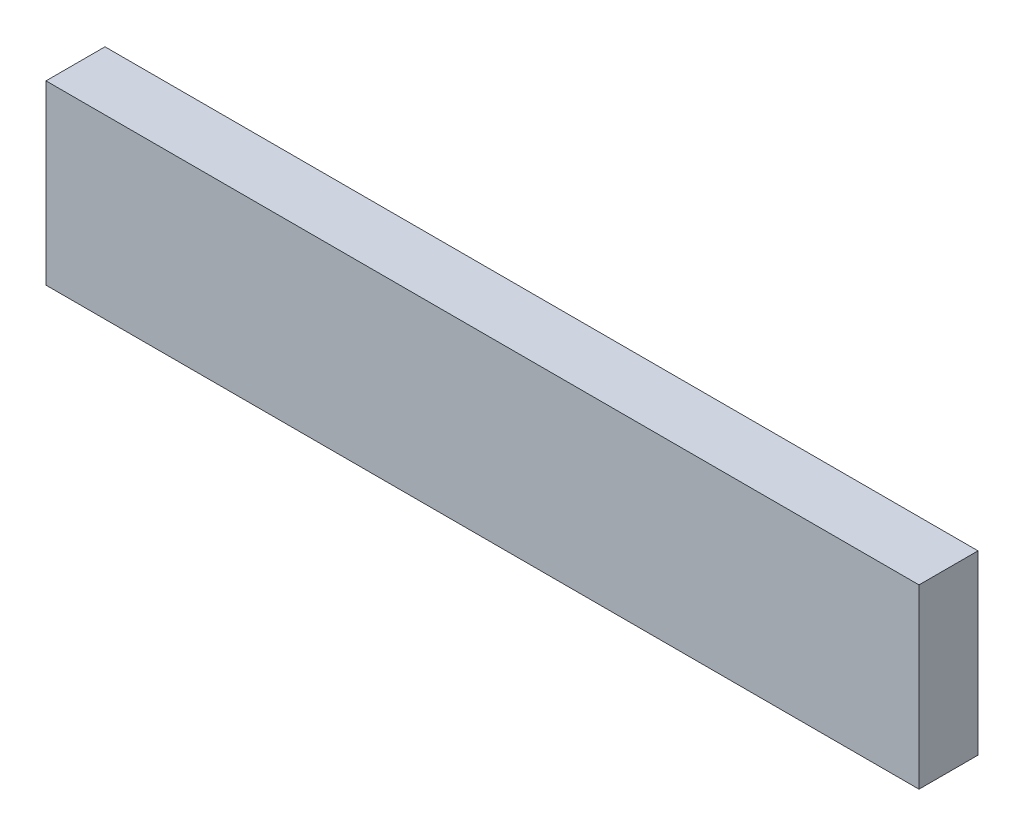
ISO-10303-21;
HEADER;
FILE_DESCRIPTION(('STEP AP214'),'2;1');
FILE_NAME('part.step','',(''),(''),'','','');
FILE_SCHEMA(('AUTOMOTIVE_DESIGN { 1 0 10303 214 1 1 1 1 }'));
ENDSEC;
DATA;
#1=APPLICATION_CONTEXT('core data for automotive mechanical design processes');
#2=APPLICATION_PROTOCOL_DEFINITION('international standard','automotive_design',2000,#1);
#3=PRODUCT_CONTEXT('',#1,'mechanical');
#4=PRODUCT('Part','Part','',(#3));
#5=PRODUCT_RELATED_PRODUCT_CATEGORY('part','',(#4));
#6=PRODUCT_DEFINITION_FORMATION('','',#4);
#7=PRODUCT_DEFINITION_CONTEXT('part definition',#1,'design');
#8=PRODUCT_DEFINITION('design','',#6,#7);
#9=PRODUCT_DEFINITION_SHAPE('','',#8);
#10=(LENGTH_UNIT() NAMED_UNIT(*) SI_UNIT(.MILLI.,.METRE.));
#11=(NAMED_UNIT(*) PLANE_ANGLE_UNIT() SI_UNIT($,.RADIAN.));
#12=(NAMED_UNIT(*) SI_UNIT($,.STERADIAN.) SOLID_ANGLE_UNIT());
#13=UNCERTAINTY_MEASURE_WITH_UNIT(LENGTH_MEASURE(1.E-05),#10,'distance_accuracy_value','');
#14=(GEOMETRIC_REPRESENTATION_CONTEXT(3) GLOBAL_UNCERTAINTY_ASSIGNED_CONTEXT((#13)) GLOBAL_UNIT_ASSIGNED_CONTEXT((#10,
#11,#12)) REPRESENTATION_CONTEXT('',''));
#15=CARTESIAN_POINT('',(0.,0.,0.));
#16=DIRECTION('',(0.,0.,1.));
#17=DIRECTION('',(1.,0.,0.));
#18=AXIS2_PLACEMENT_3D('',#15,#16,#17);
#19=CARTESIAN_POINT('',(37.,7.5,5.));
#20=DIRECTION('',(-1.,0.,0.));
#21=DIRECTION('',(0.,0.,1.));
#22=AXIS2_PLACEMENT_3D('',#19,#20,#21);
#23=PLANE('',#22);
#24=DIRECTION('',(0.,1.,0.));
#25=VECTOR('',#24,1.);
#26=CARTESIAN_POINT('',(37.,7.5,0.));
#27=LINE('',#26,#25);
#28=CARTESIAN_POINT('',(37.,-7.5,0.));
#29=VERTEX_POINT('',#28);
#30=CARTESIAN_POINT('',(37.,7.5,0.));
#31=VERTEX_POINT('',#30);
#32=EDGE_CURVE('E107',#29,#31,#27,.T.);
#33=ORIENTED_EDGE('',*,*,#32,.T.);
#34=DIRECTION('',(0.,0.,-1.));
#35=VECTOR('',#34,1.);
#36=CARTESIAN_POINT('',(37.,7.5,5.));
#37=LINE('',#36,#35);
#38=CARTESIAN_POINT('',(37.,7.5,5.));
#39=VERTEX_POINT('',#38);
#40=EDGE_CURVE('E11',#39,#31,#37,.T.);
#41=ORIENTED_EDGE('',*,*,#40,.F.);
#42=DIRECTION('',(0.,1.,0.));
#43=VECTOR('',#42,1.);
#44=CARTESIAN_POINT('',(37.,7.5,5.));
#45=LINE('',#44,#43);
#46=CARTESIAN_POINT('',(37.,-7.5,5.));
#47=VERTEX_POINT('',#46);
#48=EDGE_CURVE('E91',#47,#39,#45,.T.);
#49=ORIENTED_EDGE('',*,*,#48,.F.);
#50=DIRECTION('',(0.,0.,-1.));
#51=VECTOR('',#50,1.);
#52=CARTESIAN_POINT('',(37.,-7.5,5.));
#53=LINE('',#52,#51);
#54=EDGE_CURVE('E103',#47,#29,#53,.T.);
#55=ORIENTED_EDGE('',*,*,#54,.T.);
#56=EDGE_LOOP('',(#33,#41,#49,#55));
#57=FACE_BOUND('',#56,.T.);
#58=ADVANCED_FACE('F39',(#57),#23,.F.);
#59=CARTESIAN_POINT('',(-37.,7.5,5.));
#60=DIRECTION('',(0.,-1.,0.));
#61=DIRECTION('',(0.,0.,-1.));
#62=AXIS2_PLACEMENT_3D('',#59,#60,#61);
#63=PLANE('',#62);
#64=DIRECTION('',(-1.,0.,0.));
#65=VECTOR('',#64,1.);
#66=CARTESIAN_POINT('',(-37.,7.5,0.));
#67=LINE('',#66,#65);
#68=CARTESIAN_POINT('',(-37.,7.5,0.));
#69=VERTEX_POINT('',#68);
#70=EDGE_CURVE('E96',#31,#69,#67,.T.);
#71=ORIENTED_EDGE('',*,*,#70,.T.);
#72=DIRECTION('',(0.,0.,-1.));
#73=VECTOR('',#72,1.);
#74=CARTESIAN_POINT('',(-37.,7.5,5.));
#75=LINE('',#74,#73);
#76=CARTESIAN_POINT('',(-37.,7.5,5.));
#77=VERTEX_POINT('',#76);
#78=EDGE_CURVE('E48',#77,#69,#75,.T.);
#79=ORIENTED_EDGE('',*,*,#78,.F.);
#80=DIRECTION('',(-1.,0.,0.));
#81=VECTOR('',#80,1.);
#82=CARTESIAN_POINT('',(-37.,7.5,5.));
#83=LINE('',#82,#81);
#84=EDGE_CURVE('E86',#39,#77,#83,.T.);
#85=ORIENTED_EDGE('',*,*,#84,.F.);
#86=ORIENTED_EDGE('',*,*,#40,.T.);
#87=EDGE_LOOP('',(#71,#79,#85,#86));
#88=FACE_BOUND('',#87,.T.);
#89=ADVANCED_FACE('F95',(#88),#63,.F.);
#90=CARTESIAN_POINT('',(-37.,7.5,5.));
#91=DIRECTION('',(1.,0.,0.));
#92=DIRECTION('',(0.,0.,-1.));
#93=AXIS2_PLACEMENT_3D('',#90,#91,#92);
#94=PLANE('',#93);
#95=DIRECTION('',(0.,-1.,0.));
#96=VECTOR('',#95,1.);
#97=CARTESIAN_POINT('',(-37.,7.5,0.));
#98=LINE('',#97,#96);
#99=CARTESIAN_POINT('',(-37.,-7.5,0.));
#100=VERTEX_POINT('',#99);
#101=EDGE_CURVE('E73',#69,#100,#98,.T.);
#102=ORIENTED_EDGE('',*,*,#101,.T.);
#103=DIRECTION('',(0.,0.,-1.));
#104=VECTOR('',#103,1.);
#105=CARTESIAN_POINT('',(-37.,-7.5,5.));
#106=LINE('',#105,#104);
#107=CARTESIAN_POINT('',(-37.,-7.5,5.));
#108=VERTEX_POINT('',#107);
#109=EDGE_CURVE('E98',#108,#100,#106,.T.);
#110=ORIENTED_EDGE('',*,*,#109,.F.);
#111=DIRECTION('',(0.,-1.,0.));
#112=VECTOR('',#111,1.);
#113=CARTESIAN_POINT('',(-37.,7.5,5.));
#114=LINE('',#113,#112);
#115=EDGE_CURVE('E89',#77,#108,#114,.T.);
#116=ORIENTED_EDGE('',*,*,#115,.F.);
#117=ORIENTED_EDGE('',*,*,#78,.T.);
#118=EDGE_LOOP('',(#102,#110,#116,#117));
#119=FACE_BOUND('',#118,.T.);
#120=ADVANCED_FACE('F99',(#119),#94,.F.);
#121=CARTESIAN_POINT('',(-37.,-7.5,5.));
#122=DIRECTION('',(0.,1.,0.));
#123=DIRECTION('',(0.,0.,1.));
#124=AXIS2_PLACEMENT_3D('',#121,#122,#123);
#125=PLANE('',#124);
#126=DIRECTION('',(1.,0.,0.));
#127=VECTOR('',#126,1.);
#128=CARTESIAN_POINT('',(-37.,-7.5,0.));
#129=LINE('',#128,#127);
#130=EDGE_CURVE('E79',#100,#29,#129,.T.);
#131=ORIENTED_EDGE('',*,*,#130,.T.);
#132=ORIENTED_EDGE('',*,*,#54,.F.);
#133=DIRECTION('',(1.,0.,0.));
#134=VECTOR('',#133,1.);
#135=CARTESIAN_POINT('',(-37.,-7.5,5.));
#136=LINE('',#135,#134);
#137=EDGE_CURVE('E56',#108,#47,#136,.T.);
#138=ORIENTED_EDGE('',*,*,#137,.F.);
#139=ORIENTED_EDGE('',*,*,#109,.T.);
#140=EDGE_LOOP('',(#131,#132,#138,#139));
#141=FACE_BOUND('',#140,.T.);
#142=ADVANCED_FACE('F120',(#141),#125,.F.);
#143=CARTESIAN_POINT('',(0.,0.,5.));
#144=DIRECTION('',(0.,0.,1.));
#145=DIRECTION('',(1.,0.,0.));
#146=AXIS2_PLACEMENT_3D('',#143,#144,#145);
#147=PLANE('',#146);
#148=ORIENTED_EDGE('',*,*,#48,.T.);
#149=ORIENTED_EDGE('',*,*,#84,.T.);
#150=ORIENTED_EDGE('',*,*,#115,.T.);
#151=ORIENTED_EDGE('',*,*,#137,.T.);
#152=EDGE_LOOP('',(#148,#149,#150,#151));
#153=FACE_BOUND('',#152,.T.);
#154=ADVANCED_FACE('F87',(#153),#147,.T.);
#155=CARTESIAN_POINT('',(0.,0.,0.));
#156=DIRECTION('',(0.,0.,1.));
#157=DIRECTION('',(1.,0.,0.));
#158=AXIS2_PLACEMENT_3D('',#155,#156,#157);
#159=PLANE('',#158);
#160=ORIENTED_EDGE('',*,*,#32,.F.);
#161=ORIENTED_EDGE('',*,*,#130,.F.);
#162=ORIENTED_EDGE('',*,*,#101,.F.);
#163=ORIENTED_EDGE('',*,*,#70,.F.);
#164=EDGE_LOOP('',(#160,#161,#162,#163));
#165=FACE_BOUND('',#164,.T.);
#166=ADVANCED_FACE('F123',(#165),#159,.F.);
#167=CLOSED_SHELL('',(#58,#89,#120,#142,#154,#166));
#168=MANIFOLD_SOLID_BREP('B2',#167);
#169=ADVANCED_BREP_SHAPE_REPRESENTATION('',(#18,#168),#14);
#170=SHAPE_DEFINITION_REPRESENTATION(#9,#169);
ENDSEC;
END-ISO-10303-21;
